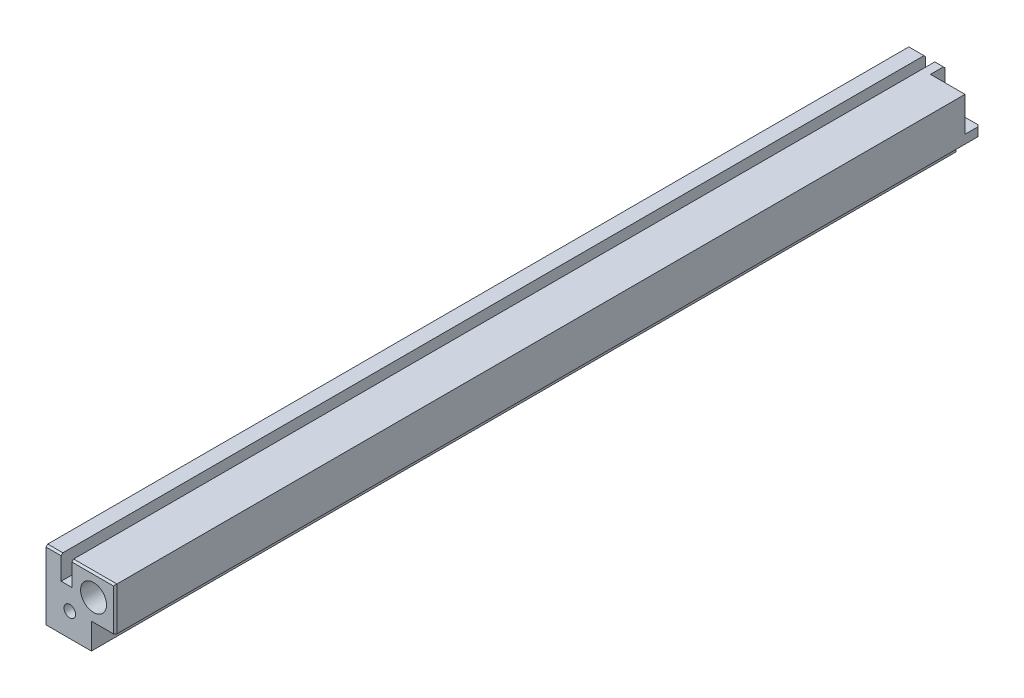
ISO-10303-21;
HEADER;
FILE_DESCRIPTION(('STEP AP214'),'2;1');
FILE_NAME('part.step','',(''),(''),'','','');
FILE_SCHEMA(('AUTOMOTIVE_DESIGN { 1 0 10303 214 1 1 1 1 }'));
ENDSEC;
DATA;
#1=APPLICATION_CONTEXT('core data for automotive mechanical design processes');
#2=APPLICATION_PROTOCOL_DEFINITION('international standard','automotive_design',2000,#1);
#3=PRODUCT_CONTEXT('',#1,'mechanical');
#4=PRODUCT('Part','Part','',(#3));
#5=PRODUCT_RELATED_PRODUCT_CATEGORY('part','',(#4));
#6=PRODUCT_DEFINITION_FORMATION('','',#4);
#7=PRODUCT_DEFINITION_CONTEXT('part definition',#1,'design');
#8=PRODUCT_DEFINITION('design','',#6,#7);
#9=PRODUCT_DEFINITION_SHAPE('','',#8);
#10=(LENGTH_UNIT() NAMED_UNIT(*) SI_UNIT(.MILLI.,.METRE.));
#11=(NAMED_UNIT(*) PLANE_ANGLE_UNIT() SI_UNIT($,.RADIAN.));
#12=(NAMED_UNIT(*) SI_UNIT($,.STERADIAN.) SOLID_ANGLE_UNIT());
#13=UNCERTAINTY_MEASURE_WITH_UNIT(LENGTH_MEASURE(1.E-05),#10,'distance_accuracy_value','');
#14=(GEOMETRIC_REPRESENTATION_CONTEXT(3) GLOBAL_UNCERTAINTY_ASSIGNED_CONTEXT((#13)) GLOBAL_UNIT_ASSIGNED_CONTEXT((#10,
#11,#12)) REPRESENTATION_CONTEXT('',''));
#15=CARTESIAN_POINT('',(0.,0.,0.));
#16=DIRECTION('',(0.,0.,1.));
#17=DIRECTION('',(1.,0.,0.));
#18=AXIS2_PLACEMENT_3D('',#15,#16,#17);
#19=CARTESIAN_POINT('',(-475.615205241627,-3.55874384236452,200.));
#20=DIRECTION('',(0.,-1.,0.));
#21=DIRECTION('',(0.,0.,-1.));
#22=AXIS2_PLACEMENT_3D('',#19,#20,#21);
#23=PLANE('',#22);
#24=DIRECTION('',(0.,0.,-1.));
#25=VECTOR('',#24,1.);
#26=CARTESIAN_POINT('',(-475.615205241627,-3.55874384236452,200.));
#27=LINE('',#26,#25);
#28=CARTESIAN_POINT('',(-475.615205241627,-3.55874384236452,199.6));
#29=VERTEX_POINT('',#28);
#30=CARTESIAN_POINT('',(-475.615205241627,-3.55874384236452,0.400000000000092));
#31=VERTEX_POINT('',#30);
#32=EDGE_CURVE('E221',#29,#31,#27,.T.);
#33=ORIENTED_EDGE('',*,*,#32,.F.);
#34=DIRECTION('',(1.,0.,0.));
#35=VECTOR('',#34,1.);
#36=CARTESIAN_POINT('',(-472.115205241627,-3.55874384236452,199.6));
#37=LINE('',#36,#35);
#38=CARTESIAN_POINT('',(-472.115205241627,-3.55874384236452,199.6));
#39=VERTEX_POINT('',#38);
#40=EDGE_CURVE('E258',#29,#39,#37,.T.);
#41=ORIENTED_EDGE('',*,*,#40,.T.);
#42=DIRECTION('',(0.,0.,1.));
#43=VECTOR('',#42,1.);
#44=CARTESIAN_POINT('',(-472.115205241627,-3.55874384236452,0.));
#45=LINE('',#44,#43);
#46=CARTESIAN_POINT('',(-472.115205241627,-3.55874384236452,0.400000000000092));
#47=VERTEX_POINT('',#46);
#48=EDGE_CURVE('E216',#47,#39,#45,.T.);
#49=ORIENTED_EDGE('',*,*,#48,.F.);
#50=DIRECTION('',(-1.,0.,0.));
#51=VECTOR('',#50,1.);
#52=CARTESIAN_POINT('',(-475.615205241627,-3.55874384236452,0.400000000000092));
#53=LINE('',#52,#51);
#54=EDGE_CURVE('E255',#47,#31,#53,.T.);
#55=ORIENTED_EDGE('',*,*,#54,.T.);
#56=EDGE_LOOP('',(#33,#41,#49,#55));
#57=FACE_BOUND('',#56,.T.);
#58=ADVANCED_FACE('F34',(#57),#23,.F.);
#59=CARTESIAN_POINT('',(-459.615205241627,-3.55874384236452,200.));
#60=DIRECTION('',(-1.,0.,0.));
#61=DIRECTION('',(0.,-1.,0.));
#62=AXIS2_PLACEMENT_3D('',#59,#60,#61);
#63=PLANE('',#62);
#64=DIRECTION('',(0.,0.,-1.));
#65=VECTOR('',#64,1.);
#66=CARTESIAN_POINT('',(-459.615205241627,-11.5587438423645,3.00000000000013));
#67=LINE('',#66,#65);
#68=CARTESIAN_POINT('',(-459.615205241627,-11.5587438423645,3.40000000000012));
#69=VERTEX_POINT('',#68);
#70=CARTESIAN_POINT('',(-459.615205241627,-11.5587438423645,0.400000000000099));
#71=VERTEX_POINT('',#70);
#72=EDGE_CURVE('E58',#69,#71,#67,.T.);
#73=ORIENTED_EDGE('',*,*,#72,.F.);
#74=DIRECTION('',(0.,1.,0.));
#75=VECTOR('',#74,1.);
#76=CARTESIAN_POINT('',(-459.615205241627,-3.55874384236452,3.40000000000012));
#77=LINE('',#76,#75);
#78=CARTESIAN_POINT('',(-459.615205241627,-3.55874384236452,3.40000000000012));
#79=VERTEX_POINT('',#78);
#80=EDGE_CURVE('E284',#69,#79,#77,.T.);
#81=ORIENTED_EDGE('',*,*,#80,.T.);
#82=DIRECTION('',(0.,0.,-1.));
#83=VECTOR('',#82,1.);
#84=CARTESIAN_POINT('',(-459.615205241627,-3.55874384236452,200.));
#85=LINE('',#84,#83);
#86=CARTESIAN_POINT('',(-459.615205241627,-3.55874384236452,199.6));
#87=VERTEX_POINT('',#86);
#88=EDGE_CURVE('E224',#87,#79,#85,.T.);
#89=ORIENTED_EDGE('',*,*,#88,.F.);
#90=DIRECTION('',(0.,-1.,0.));
#91=VECTOR('',#90,1.);
#92=CARTESIAN_POINT('',(-459.615205241627,-13.5587438423645,199.6));
#93=LINE('',#92,#91);
#94=CARTESIAN_POINT('',(-459.615205241627,-13.5587438423645,199.6));
#95=VERTEX_POINT('',#94);
#96=EDGE_CURVE('E237',#87,#95,#93,.T.);
#97=ORIENTED_EDGE('',*,*,#96,.T.);
#98=DIRECTION('',(0.,0.,1.));
#99=VECTOR('',#98,1.);
#100=CARTESIAN_POINT('',(-459.615205241627,-13.5587438423645,0.));
#101=LINE('',#100,#99);
#102=CARTESIAN_POINT('',(-459.615205241627,-13.5587438423645,0.400000000000092));
#103=VERTEX_POINT('',#102);
#104=EDGE_CURVE('E195',#103,#95,#101,.T.);
#105=ORIENTED_EDGE('',*,*,#104,.F.);
#106=DIRECTION('',(0.,1.,0.));
#107=VECTOR('',#106,1.);
#108=CARTESIAN_POINT('',(-459.615205241627,-3.55874384236452,0.400000000000092));
#109=LINE('',#108,#107);
#110=EDGE_CURVE('E235',#103,#71,#109,.T.);
#111=ORIENTED_EDGE('',*,*,#110,.T.);
#112=EDGE_LOOP('',(#73,#81,#89,#97,#105,#111));
#113=FACE_BOUND('',#112,.T.);
#114=ADVANCED_FACE('F302',(#113),#63,.F.);
#115=ORIENTED_EDGE('',*,*,#88,.T.);
#116=DIRECTION('',(-1.,0.,0.));
#117=VECTOR('',#116,1.);
#118=CARTESIAN_POINT('',(-467.615205241627,-3.55874384236452,3.40000000000012));
#119=LINE('',#118,#117);
#120=CARTESIAN_POINT('',(-467.615205241627,-3.55874384236452,3.40000000000012));
#121=VERTEX_POINT('',#120);
#122=EDGE_CURVE('E286',#79,#121,#119,.T.);
#123=ORIENTED_EDGE('',*,*,#122,.T.);
#124=DIRECTION('',(0.,0.,-1.));
#125=VECTOR('',#124,1.);
#126=CARTESIAN_POINT('',(-467.615205241627,-3.55874384236452,3.00000000000013));
#127=LINE('',#126,#125);
#128=CARTESIAN_POINT('',(-467.615205241627,-3.55874384236452,0.400000000000093));
#129=VERTEX_POINT('',#128);
#130=EDGE_CURVE('E50',#121,#129,#127,.T.);
#131=ORIENTED_EDGE('',*,*,#130,.T.);
#132=DIRECTION('',(-1.,0.,0.));
#133=VECTOR('',#132,1.);
#134=CARTESIAN_POINT('',(-475.615205241627,-3.55874384236452,0.400000000000092));
#135=LINE('',#134,#133);
#136=CARTESIAN_POINT('',(-469.615205241627,-3.55874384236452,0.400000000000092));
#137=VERTEX_POINT('',#136);
#138=EDGE_CURVE('E247',#129,#137,#135,.T.);
#139=ORIENTED_EDGE('',*,*,#138,.T.);
#140=DIRECTION('',(0.,0.,1.));
#141=VECTOR('',#140,1.);
#142=CARTESIAN_POINT('',(-469.615205241627,-3.55874384236452,0.));
#143=LINE('',#142,#141);
#144=CARTESIAN_POINT('',(-469.615205241627,-3.55874384236452,199.6));
#145=VERTEX_POINT('',#144);
#146=EDGE_CURVE('E368',#137,#145,#143,.T.);
#147=ORIENTED_EDGE('',*,*,#146,.T.);
#148=DIRECTION('',(1.,0.,0.));
#149=VECTOR('',#148,1.);
#150=CARTESIAN_POINT('',(-459.615205241627,-3.55874384236452,199.6));
#151=LINE('',#150,#149);
#152=EDGE_CURVE('E249',#145,#87,#151,.T.);
#153=ORIENTED_EDGE('',*,*,#152,.T.);
#154=EDGE_LOOP('',(#115,#123,#131,#139,#147,#153));
#155=FACE_BOUND('',#154,.T.);
#156=ADVANCED_FACE('F306',(#155),#23,.F.);
#157=CARTESIAN_POINT('',(-475.615205241627,-3.55874384236452,200.));
#158=DIRECTION('',(1.,0.,0.));
#159=DIRECTION('',(0.,1.,0.));
#160=AXIS2_PLACEMENT_3D('',#157,#158,#159);
#161=PLANE('',#160);
#162=DIRECTION('',(0.,-1.,0.));
#163=VECTOR('',#162,1.);
#164=CARTESIAN_POINT('',(-475.615205241627,-3.55874384236452,200.));
#165=LINE('',#164,#163);
#166=CARTESIAN_POINT('',(-475.615205241627,-3.95874384236453,200.));
#167=VERTEX_POINT('',#166);
#168=CARTESIAN_POINT('',(-475.615205241627,-19.5587438423645,200.));
#169=VERTEX_POINT('',#168);
#170=EDGE_CURVE('E211',#167,#169,#165,.T.);
#171=ORIENTED_EDGE('',*,*,#170,.F.);
#172=DIRECTION('',(0.,0.707106781186548,-0.707106781186548));
#173=VECTOR('',#172,1.);
#174=CARTESIAN_POINT('',(-475.615205241627,-3.95874384236453,200.));
#175=LINE('',#174,#173);
#176=EDGE_CURVE('E253',#167,#29,#175,.T.);
#177=ORIENTED_EDGE('',*,*,#176,.T.);
#178=ORIENTED_EDGE('',*,*,#32,.T.);
#179=DIRECTION('',(0.,0.707106781186548,0.707106781186548));
#180=VECTOR('',#179,1.);
#181=CARTESIAN_POINT('',(-475.615205241627,-3.55874384236452,0.400000000000092));
#182=LINE('',#181,#180);
#183=CARTESIAN_POINT('',(-475.615205241627,-3.95874384236453,0.));
#184=VERTEX_POINT('',#183);
#185=EDGE_CURVE('E251',#31,#184,#182,.F.);
#186=ORIENTED_EDGE('',*,*,#185,.T.);
#187=DIRECTION('',(0.,-1.,0.));
#188=VECTOR('',#187,1.);
#189=CARTESIAN_POINT('',(-475.615205241627,-3.55874384236452,0.));
#190=LINE('',#189,#188);
#191=CARTESIAN_POINT('',(-475.615205241627,-19.5587438423645,0.));
#192=VERTEX_POINT('',#191);
#193=EDGE_CURVE('E212',#184,#192,#190,.T.);
#194=ORIENTED_EDGE('',*,*,#193,.T.);
#195=DIRECTION('',(0.,0.,-1.));
#196=VECTOR('',#195,1.);
#197=CARTESIAN_POINT('',(-475.615205241627,-19.5587438423645,200.));
#198=LINE('',#197,#196);
#199=EDGE_CURVE('E210',#169,#192,#198,.T.);
#200=ORIENTED_EDGE('',*,*,#199,.F.);
#201=EDGE_LOOP('',(#171,#177,#178,#186,#194,#200));
#202=FACE_BOUND('',#201,.T.);
#203=ADVANCED_FACE('F387',(#202),#161,.F.);
#204=CARTESIAN_POINT('',(-475.615205241627,-19.5587438423645,200.));
#205=DIRECTION('',(0.,1.,0.));
#206=DIRECTION('',(0.,0.,1.));
#207=AXIS2_PLACEMENT_3D('',#204,#205,#206);
#208=PLANE('',#207);
#209=DIRECTION('',(1.,0.,0.));
#210=VECTOR('',#209,1.);
#211=CARTESIAN_POINT('',(-475.615205241627,-19.5587438423645,0.));
#212=LINE('',#211,#210);
#213=CARTESIAN_POINT('',(-465.115205241627,-19.5587438423645,0.));
#214=VERTEX_POINT('',#213);
#215=EDGE_CURVE('E189',#192,#214,#212,.T.);
#216=ORIENTED_EDGE('',*,*,#215,.T.);
#217=DIRECTION('',(0.,0.,-1.));
#218=VECTOR('',#217,1.);
#219=CARTESIAN_POINT('',(-465.115205241627,-19.5587438423645,0.));
#220=LINE('',#219,#218);
#221=CARTESIAN_POINT('',(-465.115205241627,-19.5587438423645,200.));
#222=VERTEX_POINT('',#221);
#223=EDGE_CURVE('E198',#222,#214,#220,.T.);
#224=ORIENTED_EDGE('',*,*,#223,.F.);
#225=DIRECTION('',(1.,0.,0.));
#226=VECTOR('',#225,1.);
#227=CARTESIAN_POINT('',(-475.615205241627,-19.5587438423645,200.));
#228=LINE('',#227,#226);
#229=EDGE_CURVE('E214',#169,#222,#228,.T.);
#230=ORIENTED_EDGE('',*,*,#229,.F.);
#231=ORIENTED_EDGE('',*,*,#199,.T.);
#232=EDGE_LOOP('',(#216,#224,#230,#231));
#233=FACE_BOUND('',#232,.T.);
#234=ADVANCED_FACE('F208',(#233),#208,.F.);
#235=CARTESIAN_POINT('',(-467.615205241627,-11.5587438423645,200.));
#236=DIRECTION('',(0.,0.,1.));
#237=DIRECTION('',(1.,0.,0.));
#238=AXIS2_PLACEMENT_3D('',#235,#236,#237);
#239=PLANE('',#238);
#240=ORIENTED_EDGE('',*,*,#229,.T.);
#241=DIRECTION('',(0.,-1.,0.));
#242=VECTOR('',#241,1.);
#243=CARTESIAN_POINT('',(-465.115205241627,-16.0587438423645,200.));
#244=LINE('',#243,#242);
#245=CARTESIAN_POINT('',(-465.115205241627,-13.5587438423645,200.));
#246=VERTEX_POINT('',#245);
#247=EDGE_CURVE('E201',#246,#222,#244,.T.);
#248=ORIENTED_EDGE('',*,*,#247,.F.);
#249=DIRECTION('',(-1.,0.,0.));
#250=VECTOR('',#249,1.);
#251=CARTESIAN_POINT('',(-459.615205241627,-13.5587438423645,200.));
#252=LINE('',#251,#250);
#253=CARTESIAN_POINT('',(-460.015205241627,-13.5587438423645,200.));
#254=VERTEX_POINT('',#253);
#255=EDGE_CURVE('E274',#254,#246,#252,.T.);
#256=ORIENTED_EDGE('',*,*,#255,.F.);
#257=DIRECTION('',(0.,1.,0.));
#258=VECTOR('',#257,1.);
#259=CARTESIAN_POINT('',(-460.015205241627,-3.55874384236452,200.));
#260=LINE('',#259,#258);
#261=CARTESIAN_POINT('',(-460.015205241627,-3.95874384236453,200.));
#262=VERTEX_POINT('',#261);
#263=EDGE_CURVE('E232',#254,#262,#260,.T.);
#264=ORIENTED_EDGE('',*,*,#263,.T.);
#265=DIRECTION('',(-1.,0.,0.));
#266=VECTOR('',#265,1.);
#267=CARTESIAN_POINT('',(-469.615205241627,-3.95874384236453,200.));
#268=LINE('',#267,#266);
#269=CARTESIAN_POINT('',(-469.615205241627,-3.95874384236453,200.));
#270=VERTEX_POINT('',#269);
#271=EDGE_CURVE('E230',#262,#270,#268,.T.);
#272=ORIENTED_EDGE('',*,*,#271,.T.);
#273=DIRECTION('',(0.,1.,0.));
#274=VECTOR('',#273,1.);
#275=CARTESIAN_POINT('',(-469.615205241627,-3.55874384236452,200.));
#276=LINE('',#275,#274);
#277=CARTESIAN_POINT('',(-469.615205241627,-9.05874384236452,200.));
#278=VERTEX_POINT('',#277);
#279=EDGE_CURVE('E351',#278,#270,#276,.T.);
#280=ORIENTED_EDGE('',*,*,#279,.F.);
#281=DIRECTION('',(1.,0.,0.));
#282=VECTOR('',#281,1.);
#283=CARTESIAN_POINT('',(-472.115205241627,-9.05874384236452,200.));
#284=LINE('',#283,#282);
#285=CARTESIAN_POINT('',(-472.115205241627,-9.05874384236452,200.));
#286=VERTEX_POINT('',#285);
#287=EDGE_CURVE('E360',#286,#278,#284,.T.);
#288=ORIENTED_EDGE('',*,*,#287,.F.);
#289=DIRECTION('',(0.,-1.,0.));
#290=VECTOR('',#289,1.);
#291=CARTESIAN_POINT('',(-472.115205241627,-3.55874384236452,200.));
#292=LINE('',#291,#290);
#293=CARTESIAN_POINT('',(-472.115205241627,-3.95874384236453,200.));
#294=VERTEX_POINT('',#293);
#295=EDGE_CURVE('E358',#294,#286,#292,.T.);
#296=ORIENTED_EDGE('',*,*,#295,.F.);
#297=DIRECTION('',(-1.,0.,0.));
#298=VECTOR('',#297,1.);
#299=CARTESIAN_POINT('',(-475.615205241627,-3.95874384236453,200.));
#300=LINE('',#299,#298);
#301=EDGE_CURVE('E227',#294,#167,#300,.T.);
#302=ORIENTED_EDGE('',*,*,#301,.T.);
#303=ORIENTED_EDGE('',*,*,#170,.T.);
#304=EDGE_LOOP('',(#240,#248,#256,#264,#272,#280,#288,#296,#302,#303));
#305=FACE_BOUND('',#304,.T.);
#306=CARTESIAN_POINT('',(-464.615205241627,-8.55874384236452,200.));
#307=DIRECTION('',(0.,0.,-1.));
#308=DIRECTION('',(-1.,0.,0.));
#309=AXIS2_PLACEMENT_3D('',#306,#307,#308);
#310=CIRCLE('',#309,2.99999999999999);
#311=CARTESIAN_POINT('',(-467.615205241627,-8.55874384236452,200.));
#312=VERTEX_POINT('',#311);
#313=EDGE_CURVE('E441',#312,#312,#310,.T.);
#314=ORIENTED_EDGE('',*,*,#313,.T.);
#315=EDGE_LOOP('',(#314));
#316=FACE_BOUND('',#315,.T.);
#317=CARTESIAN_POINT('',(-470.115205241627,-14.0587438423645,200.));
#318=DIRECTION('',(0.,0.,1.));
#319=DIRECTION('',(1.,0.,0.));
#320=AXIS2_PLACEMENT_3D('',#317,#318,#319);
#321=CIRCLE('',#320,1.34999999999999);
#322=CARTESIAN_POINT('',(-468.765205241627,-14.0587438423645,200.));
#323=VERTEX_POINT('',#322);
#324=EDGE_CURVE('E333',#323,#323,#321,.T.);
#325=ORIENTED_EDGE('',*,*,#324,.F.);
#326=EDGE_LOOP('',(#325));
#327=FACE_BOUND('',#326,.T.);
#328=ADVANCED_FACE('F380',(#305,#316,#327),#239,.T.);
#329=CARTESIAN_POINT('',(-467.615205241627,-11.5587438423645,0.));
#330=DIRECTION('',(0.,0.,1.));
#331=DIRECTION('',(1.,0.,0.));
#332=AXIS2_PLACEMENT_3D('',#329,#330,#331);
#333=PLANE('',#332);
#334=CARTESIAN_POINT('',(-470.115205241627,-14.0587438423645,0.));
#335=DIRECTION('',(0.,0.,-1.));
#336=DIRECTION('',(-1.,0.,0.));
#337=AXIS2_PLACEMENT_3D('',#334,#335,#336);
#338=CIRCLE('',#337,1.34999999999999);
#339=CARTESIAN_POINT('',(-471.465205241627,-14.0587438423645,0.));
#340=VERTEX_POINT('',#339);
#341=EDGE_CURVE('E343',#340,#340,#338,.T.);
#342=ORIENTED_EDGE('',*,*,#341,.F.);
#343=EDGE_LOOP('',(#342));
#344=FACE_BOUND('',#343,.T.);
#345=DIRECTION('',(0.,-1.,0.));
#346=VECTOR('',#345,1.);
#347=CARTESIAN_POINT('',(-465.115205241627,-16.0587438423645,0.));
#348=LINE('',#347,#346);
#349=CARTESIAN_POINT('',(-465.115205241627,-13.5587438423645,0.));
#350=VERTEX_POINT('',#349);
#351=EDGE_CURVE('E184',#350,#214,#348,.T.);
#352=ORIENTED_EDGE('',*,*,#351,.T.);
#353=ORIENTED_EDGE('',*,*,#215,.F.);
#354=ORIENTED_EDGE('',*,*,#193,.F.);
#355=DIRECTION('',(1.,0.,0.));
#356=VECTOR('',#355,1.);
#357=CARTESIAN_POINT('',(-467.615205241627,-3.95874384236453,0.));
#358=LINE('',#357,#356);
#359=CARTESIAN_POINT('',(-472.115205241627,-3.95874384236453,0.));
#360=VERTEX_POINT('',#359);
#361=EDGE_CURVE('E264',#184,#360,#358,.T.);
#362=ORIENTED_EDGE('',*,*,#361,.T.);
#363=DIRECTION('',(0.,-1.,0.));
#364=VECTOR('',#363,1.);
#365=CARTESIAN_POINT('',(-472.115205241627,-3.55874384236452,0.));
#366=LINE('',#365,#364);
#367=CARTESIAN_POINT('',(-472.115205241627,-9.05874384236452,0.));
#368=VERTEX_POINT('',#367);
#369=EDGE_CURVE('E348',#360,#368,#366,.T.);
#370=ORIENTED_EDGE('',*,*,#369,.T.);
#371=DIRECTION('',(1.,0.,0.));
#372=VECTOR('',#371,1.);
#373=CARTESIAN_POINT('',(-472.115205241627,-9.05874384236452,0.));
#374=LINE('',#373,#372);
#375=CARTESIAN_POINT('',(-469.615205241627,-9.05874384236452,0.));
#376=VERTEX_POINT('',#375);
#377=EDGE_CURVE('E350',#368,#376,#374,.T.);
#378=ORIENTED_EDGE('',*,*,#377,.T.);
#379=DIRECTION('',(0.,1.,0.));
#380=VECTOR('',#379,1.);
#381=CARTESIAN_POINT('',(-469.615205241627,-3.55874384236452,0.));
#382=LINE('',#381,#380);
#383=CARTESIAN_POINT('',(-469.615205241627,-3.95874384236453,0.));
#384=VERTEX_POINT('',#383);
#385=EDGE_CURVE('E354',#376,#384,#382,.T.);
#386=ORIENTED_EDGE('',*,*,#385,.T.);
#387=DIRECTION('',(1.,0.,0.));
#388=VECTOR('',#387,1.);
#389=CARTESIAN_POINT('',(-467.615205241627,-3.95874384236453,0.));
#390=LINE('',#389,#388);
#391=CARTESIAN_POINT('',(-467.615205241627,-3.95874384236453,0.));
#392=VERTEX_POINT('',#391);
#393=EDGE_CURVE('E268',#384,#392,#390,.T.);
#394=ORIENTED_EDGE('',*,*,#393,.T.);
#395=DIRECTION('',(0.,1.,0.));
#396=VECTOR('',#395,1.);
#397=CARTESIAN_POINT('',(-467.615205241627,-3.55874384236452,1.29046354242725E-13));
#398=LINE('',#397,#396);
#399=CARTESIAN_POINT('',(-467.615205241627,-8.55874384236452,1.29046354242725E-13));
#400=VERTEX_POINT('',#399);
#401=EDGE_CURVE('E322',#400,#392,#398,.T.);
#402=ORIENTED_EDGE('',*,*,#401,.F.);
#403=CARTESIAN_POINT('',(-464.615205241627,-8.55874384236452,1.29046354242725E-13));
#404=DIRECTION('',(0.,0.,-1.));
#405=DIRECTION('',(-1.,0.,0.));
#406=AXIS2_PLACEMENT_3D('',#403,#404,#405);
#407=CIRCLE('',#406,3.);
#408=CARTESIAN_POINT('',(-464.615205241627,-11.5587438423645,1.29046354242725E-13));
#409=VERTEX_POINT('',#408);
#410=EDGE_CURVE('E328',#409,#400,#407,.T.);
#411=ORIENTED_EDGE('',*,*,#410,.F.);
#412=DIRECTION('',(-1.,0.,0.));
#413=VECTOR('',#412,1.);
#414=CARTESIAN_POINT('',(-459.615205241627,-11.5587438423645,1.29046354242725E-13));
#415=LINE('',#414,#413);
#416=CARTESIAN_POINT('',(-460.015205241627,-11.5587438423645,1.29046354242725E-13));
#417=VERTEX_POINT('',#416);
#418=EDGE_CURVE('E326',#417,#409,#415,.T.);
#419=ORIENTED_EDGE('',*,*,#418,.F.);
#420=DIRECTION('',(0.,-1.,0.));
#421=VECTOR('',#420,1.);
#422=CARTESIAN_POINT('',(-460.015205241627,-11.5587438423645,0.));
#423=LINE('',#422,#421);
#424=CARTESIAN_POINT('',(-460.015205241627,-13.5587438423645,0.));
#425=VERTEX_POINT('',#424);
#426=EDGE_CURVE('E266',#417,#425,#423,.T.);
#427=ORIENTED_EDGE('',*,*,#426,.T.);
#428=DIRECTION('',(-1.,0.,0.));
#429=VECTOR('',#428,1.);
#430=CARTESIAN_POINT('',(-459.615205241627,-13.5587438423645,0.));
#431=LINE('',#430,#429);
#432=EDGE_CURVE('E191',#425,#350,#431,.T.);
#433=ORIENTED_EDGE('',*,*,#432,.T.);
#434=EDGE_LOOP('',(#352,#353,#354,#362,#370,#378,#386,#394,#402,#411,#419,#427,#433));
#435=FACE_BOUND('',#434,.T.);
#436=ADVANCED_FACE('F186',(#344,#435),#333,.F.);
#437=CARTESIAN_POINT('',(-465.115205241627,-16.0587438423645,0.));
#438=DIRECTION('',(-1.,0.,0.));
#439=DIRECTION('',(0.,0.,1.));
#440=AXIS2_PLACEMENT_3D('',#437,#438,#439);
#441=PLANE('',#440);
#442=ORIENTED_EDGE('',*,*,#247,.T.);
#443=ORIENTED_EDGE('',*,*,#223,.T.);
#444=ORIENTED_EDGE('',*,*,#351,.F.);
#445=DIRECTION('',(0.,0.,1.));
#446=VECTOR('',#445,1.);
#447=CARTESIAN_POINT('',(-465.115205241627,-13.5587438423645,0.));
#448=LINE('',#447,#446);
#449=EDGE_CURVE('E361',#350,#246,#448,.T.);
#450=ORIENTED_EDGE('',*,*,#449,.T.);
#451=EDGE_LOOP('',(#442,#443,#444,#450));
#452=FACE_BOUND('',#451,.T.);
#453=ADVANCED_FACE('F199',(#452),#441,.F.);
#454=CARTESIAN_POINT('',(-459.615205241627,-13.5587438423645,0.));
#455=DIRECTION('',(0.,1.,0.));
#456=DIRECTION('',(-1.,0.,0.));
#457=AXIS2_PLACEMENT_3D('',#454,#455,#456);
#458=PLANE('',#457);
#459=ORIENTED_EDGE('',*,*,#104,.T.);
#460=DIRECTION('',(-0.707106781186548,0.,0.707106781186548));
#461=VECTOR('',#460,1.);
#462=CARTESIAN_POINT('',(-460.015205241627,-13.5587438423645,200.));
#463=LINE('',#462,#461);
#464=EDGE_CURVE('E241',#95,#254,#463,.T.);
#465=ORIENTED_EDGE('',*,*,#464,.T.);
#466=ORIENTED_EDGE('',*,*,#255,.T.);
#467=ORIENTED_EDGE('',*,*,#449,.F.);
#468=ORIENTED_EDGE('',*,*,#432,.F.);
#469=DIRECTION('',(-0.707106781186548,0.,-0.707106781186548));
#470=VECTOR('',#469,1.);
#471=CARTESIAN_POINT('',(-459.615205241627,-13.5587438423645,0.400000000000092));
#472=LINE('',#471,#470);
#473=EDGE_CURVE('E239',#425,#103,#472,.F.);
#474=ORIENTED_EDGE('',*,*,#473,.T.);
#475=EDGE_LOOP('',(#459,#465,#466,#467,#468,#474));
#476=FACE_BOUND('',#475,.T.);
#477=ADVANCED_FACE('F431',(#476),#458,.F.);
#478=CARTESIAN_POINT('',(-472.115205241627,-3.55874384236452,0.));
#479=DIRECTION('',(-1.,0.,0.));
#480=DIRECTION('',(0.,-1.,0.));
#481=AXIS2_PLACEMENT_3D('',#478,#479,#480);
#482=PLANE('',#481);
#483=ORIENTED_EDGE('',*,*,#48,.T.);
#484=DIRECTION('',(0.,-0.707106781186548,0.707106781186548));
#485=VECTOR('',#484,1.);
#486=CARTESIAN_POINT('',(-472.115205241627,-3.95874384236453,200.));
#487=LINE('',#486,#485);
#488=EDGE_CURVE('E262',#39,#294,#487,.T.);
#489=ORIENTED_EDGE('',*,*,#488,.T.);
#490=ORIENTED_EDGE('',*,*,#295,.T.);
#491=DIRECTION('',(0.,0.,1.));
#492=VECTOR('',#491,1.);
#493=CARTESIAN_POINT('',(-472.115205241627,-9.05874384236452,0.));
#494=LINE('',#493,#492);
#495=EDGE_CURVE('E357',#368,#286,#494,.T.);
#496=ORIENTED_EDGE('',*,*,#495,.F.);
#497=ORIENTED_EDGE('',*,*,#369,.F.);
#498=DIRECTION('',(0.,-0.707106781186548,-0.707106781186548));
#499=VECTOR('',#498,1.);
#500=CARTESIAN_POINT('',(-472.115205241627,-3.55874384236452,0.400000000000092));
#501=LINE('',#500,#499);
#502=EDGE_CURVE('E260',#360,#47,#501,.F.);
#503=ORIENTED_EDGE('',*,*,#502,.T.);
#504=EDGE_LOOP('',(#483,#489,#490,#496,#497,#503));
#505=FACE_BOUND('',#504,.T.);
#506=ADVANCED_FACE('F396',(#505),#482,.F.);
#507=CARTESIAN_POINT('',(-469.615205241627,-3.55874384236452,0.));
#508=DIRECTION('',(1.,0.,0.));
#509=DIRECTION('',(0.,1.,0.));
#510=AXIS2_PLACEMENT_3D('',#507,#508,#509);
#511=PLANE('',#510);
#512=ORIENTED_EDGE('',*,*,#279,.T.);
#513=DIRECTION('',(0.,0.707106781186548,-0.707106781186548));
#514=VECTOR('',#513,1.);
#515=CARTESIAN_POINT('',(-469.615205241627,-3.95874384236453,200.));
#516=LINE('',#515,#514);
#517=EDGE_CURVE('E245',#270,#145,#516,.T.);
#518=ORIENTED_EDGE('',*,*,#517,.T.);
#519=ORIENTED_EDGE('',*,*,#146,.F.);
#520=DIRECTION('',(0.,0.707106781186548,0.707106781186548));
#521=VECTOR('',#520,1.);
#522=CARTESIAN_POINT('',(-469.615205241627,-3.55874384236452,0.400000000000093));
#523=LINE('',#522,#521);
#524=EDGE_CURVE('E243',#137,#384,#523,.F.);
#525=ORIENTED_EDGE('',*,*,#524,.T.);
#526=ORIENTED_EDGE('',*,*,#385,.F.);
#527=DIRECTION('',(0.,0.,1.));
#528=VECTOR('',#527,1.);
#529=CARTESIAN_POINT('',(-469.615205241627,-9.05874384236452,0.));
#530=LINE('',#529,#528);
#531=EDGE_CURVE('E370',#376,#278,#530,.T.);
#532=ORIENTED_EDGE('',*,*,#531,.T.);
#533=EDGE_LOOP('',(#512,#518,#519,#525,#526,#532));
#534=FACE_BOUND('',#533,.T.);
#535=ADVANCED_FACE('F482',(#534),#511,.F.);
#536=CARTESIAN_POINT('',(-472.115205241627,-9.05874384236452,0.));
#537=DIRECTION('',(0.,-1.,0.));
#538=DIRECTION('',(0.,0.,-1.));
#539=AXIS2_PLACEMENT_3D('',#536,#537,#538);
#540=PLANE('',#539);
#541=ORIENTED_EDGE('',*,*,#287,.T.);
#542=ORIENTED_EDGE('',*,*,#531,.F.);
#543=ORIENTED_EDGE('',*,*,#377,.F.);
#544=ORIENTED_EDGE('',*,*,#495,.T.);
#545=EDGE_LOOP('',(#541,#542,#543,#544));
#546=FACE_BOUND('',#545,.T.);
#547=ADVANCED_FACE('F408',(#546),#540,.F.);
#548=CARTESIAN_POINT('',(-467.615205241627,-3.95874384236453,200.));
#549=DIRECTION('',(0.,0.707106781186548,0.707106781186548));
#550=DIRECTION('',(1.,0.,0.));
#551=AXIS2_PLACEMENT_3D('',#548,#549,#550);
#552=PLANE('',#551);
#553=ORIENTED_EDGE('',*,*,#517,.F.);
#554=ORIENTED_EDGE('',*,*,#271,.F.);
#555=DIRECTION('',(0.577350269189626,0.577350269189626,-0.577350269189626));
#556=VECTOR('',#555,1.);
#557=CARTESIAN_POINT('',(-462.54853857496,-6.49207717569786,202.533333333333));
#558=LINE('',#557,#556);
#559=EDGE_CURVE('E272',#87,#262,#558,.F.);
#560=ORIENTED_EDGE('',*,*,#559,.F.);
#561=ORIENTED_EDGE('',*,*,#152,.F.);
#562=EDGE_LOOP('',(#553,#554,#560,#561));
#563=FACE_BOUND('',#562,.T.);
#564=ADVANCED_FACE('F422',(#563),#552,.T.);
#565=CARTESIAN_POINT('',(-460.015205241627,-11.5587438423645,200.));
#566=DIRECTION('',(0.707106781186548,0.,0.707106781186548));
#567=DIRECTION('',(0.,-1.,0.));
#568=AXIS2_PLACEMENT_3D('',#565,#566,#567);
#569=PLANE('',#568);
#570=ORIENTED_EDGE('',*,*,#464,.F.);
#571=ORIENTED_EDGE('',*,*,#96,.F.);
#572=ORIENTED_EDGE('',*,*,#559,.T.);
#573=ORIENTED_EDGE('',*,*,#263,.F.);
#574=EDGE_LOOP('',(#570,#571,#572,#573));
#575=FACE_BOUND('',#574,.T.);
#576=ADVANCED_FACE('F427',(#575),#569,.T.);
#577=CARTESIAN_POINT('',(-467.615205241627,-3.95874384236453,200.));
#578=DIRECTION('',(0.,0.707106781186548,0.707106781186548));
#579=DIRECTION('',(1.,0.,0.));
#580=AXIS2_PLACEMENT_3D('',#577,#578,#579);
#581=PLANE('',#580);
#582=ORIENTED_EDGE('',*,*,#488,.F.);
#583=ORIENTED_EDGE('',*,*,#40,.F.);
#584=ORIENTED_EDGE('',*,*,#176,.F.);
#585=ORIENTED_EDGE('',*,*,#301,.F.);
#586=EDGE_LOOP('',(#582,#583,#584,#585));
#587=FACE_BOUND('',#586,.T.);
#588=ADVANCED_FACE('F403',(#587),#581,.T.);
#589=CARTESIAN_POINT('',(-459.615205241627,-3.55874384236452,0.400000000000092));
#590=DIRECTION('',(-0.707106781186548,0.,0.707106781186548));
#591=DIRECTION('',(0.,1.,0.));
#592=AXIS2_PLACEMENT_3D('',#589,#590,#591);
#593=PLANE('',#592);
#594=DIRECTION('',(0.707106781186548,0.,0.707106781186548));
#595=VECTOR('',#594,1.);
#596=CARTESIAN_POINT('',(-459.615205241627,-11.5587438423645,0.400000000000091));
#597=LINE('',#596,#595);
#598=EDGE_CURVE('E277',#71,#417,#597,.F.);
#599=ORIENTED_EDGE('',*,*,#598,.F.);
#600=ORIENTED_EDGE('',*,*,#110,.F.);
#601=ORIENTED_EDGE('',*,*,#473,.F.);
#602=ORIENTED_EDGE('',*,*,#426,.F.);
#603=EDGE_LOOP('',(#599,#600,#601,#602));
#604=FACE_BOUND('',#603,.T.);
#605=ADVANCED_FACE('F435',(#604),#593,.F.);
#606=CARTESIAN_POINT('',(-475.615205241627,-3.55874384236452,0.400000000000092));
#607=DIRECTION('',(0.,-0.707106781186548,0.707106781186548));
#608=DIRECTION('',(-1.,0.,0.));
#609=AXIS2_PLACEMENT_3D('',#606,#607,#608);
#610=PLANE('',#609);
#611=DIRECTION('',(0.,-0.707106781186548,-0.707106781186548));
#612=VECTOR('',#611,1.);
#613=CARTESIAN_POINT('',(-467.615205241627,-3.55874384236452,0.400000000000092));
#614=LINE('',#613,#612);
#615=EDGE_CURVE('E271',#392,#129,#614,.F.);
#616=ORIENTED_EDGE('',*,*,#615,.F.);
#617=ORIENTED_EDGE('',*,*,#393,.F.);
#618=ORIENTED_EDGE('',*,*,#524,.F.);
#619=ORIENTED_EDGE('',*,*,#138,.F.);
#620=EDGE_LOOP('',(#616,#617,#618,#619));
#621=FACE_BOUND('',#620,.T.);
#622=ADVANCED_FACE('F416',(#621),#610,.F.);
#623=CARTESIAN_POINT('',(-475.615205241627,-3.55874384236452,0.400000000000092));
#624=DIRECTION('',(0.,-0.707106781186548,0.707106781186548));
#625=DIRECTION('',(-1.,0.,0.));
#626=AXIS2_PLACEMENT_3D('',#623,#624,#625);
#627=PLANE('',#626);
#628=ORIENTED_EDGE('',*,*,#502,.F.);
#629=ORIENTED_EDGE('',*,*,#361,.F.);
#630=ORIENTED_EDGE('',*,*,#185,.F.);
#631=ORIENTED_EDGE('',*,*,#54,.F.);
#632=EDGE_LOOP('',(#628,#629,#630,#631));
#633=FACE_BOUND('',#632,.T.);
#634=ADVANCED_FACE('F392',(#633),#627,.F.);
#635=CARTESIAN_POINT('',(-470.115205241627,-14.0587438423645,14.1888381643129));
#636=DIRECTION('',(0.,0.,-1.));
#637=DIRECTION('',(-1.,0.,0.));
#638=AXIS2_PLACEMENT_3D('',#635,#636,#637);
#639=CONICAL_SURFACE('',#638,1.35,1.02974425867665);
#640=CARTESIAN_POINT('',(-470.115205241627,-14.0587438423645,15.0000000000001));
#641=VERTEX_POINT('',#640);
#642=VERTEX_LOOP('',#641);
#643=FACE_BOUND('',#642,.T.);
#644=CARTESIAN_POINT('',(-470.115205241627,-14.0587438423645,14.1888381643129));
#645=DIRECTION('',(0.,0.,-1.));
#646=DIRECTION('',(-1.,0.,0.));
#647=AXIS2_PLACEMENT_3D('',#644,#645,#646);
#648=CIRCLE('',#647,1.35);
#649=CARTESIAN_POINT('',(-471.465205241627,-14.0587438423645,14.1888381643129));
#650=VERTEX_POINT('',#649);
#651=EDGE_CURVE('E275',#650,#650,#648,.T.);
#652=ORIENTED_EDGE('',*,*,#651,.T.);
#653=EDGE_LOOP('',(#652));
#654=FACE_BOUND('',#653,.T.);
#655=ADVANCED_FACE('F487',(#643,#654),#639,.F.);
#656=CARTESIAN_POINT('',(-470.115205241627,-14.0587438423645,0.));
#657=DIRECTION('',(0.,0.,-1.));
#658=DIRECTION('',(-1.,0.,0.));
#659=AXIS2_PLACEMENT_3D('',#656,#657,#658);
#660=CYLINDRICAL_SURFACE('',#659,1.34999999999999);
#661=ORIENTED_EDGE('',*,*,#651,.F.);
#662=EDGE_LOOP('',(#661));
#663=FACE_BOUND('',#662,.T.);
#664=ORIENTED_EDGE('',*,*,#341,.T.);
#665=EDGE_LOOP('',(#664));
#666=FACE_BOUND('',#665,.T.);
#667=ADVANCED_FACE('F490',(#663,#666),#660,.F.);
#668=CARTESIAN_POINT('',(-470.115205241627,-14.0587438423645,185.811161835687));
#669=DIRECTION('',(0.,0.,1.));
#670=DIRECTION('',(1.,0.,0.));
#671=AXIS2_PLACEMENT_3D('',#668,#669,#670);
#672=CONICAL_SURFACE('',#671,1.35,1.02974425867665);
#673=CARTESIAN_POINT('',(-470.115205241627,-14.0587438423645,185.));
#674=VERTEX_POINT('',#673);
#675=VERTEX_LOOP('',#674);
#676=FACE_BOUND('',#675,.T.);
#677=CARTESIAN_POINT('',(-470.115205241627,-14.0587438423645,185.811161835687));
#678=DIRECTION('',(0.,0.,1.));
#679=DIRECTION('',(1.,0.,0.));
#680=AXIS2_PLACEMENT_3D('',#677,#678,#679);
#681=CIRCLE('',#680,1.35);
#682=CARTESIAN_POINT('',(-468.765205241627,-14.0587438423645,185.811161835687));
#683=VERTEX_POINT('',#682);
#684=EDGE_CURVE('E340',#683,#683,#681,.T.);
#685=ORIENTED_EDGE('',*,*,#684,.T.);
#686=EDGE_LOOP('',(#685));
#687=FACE_BOUND('',#686,.T.);
#688=ADVANCED_FACE('F494',(#676,#687),#672,.F.);
#689=CARTESIAN_POINT('',(-470.115205241627,-14.0587438423645,200.));
#690=DIRECTION('',(0.,0.,1.));
#691=DIRECTION('',(1.,0.,0.));
#692=AXIS2_PLACEMENT_3D('',#689,#690,#691);
#693=CYLINDRICAL_SURFACE('',#692,1.34999999999999);
#694=ORIENTED_EDGE('',*,*,#684,.F.);
#695=EDGE_LOOP('',(#694));
#696=FACE_BOUND('',#695,.T.);
#697=ORIENTED_EDGE('',*,*,#324,.T.);
#698=EDGE_LOOP('',(#697));
#699=FACE_BOUND('',#698,.T.);
#700=ADVANCED_FACE('F453',(#696,#699),#693,.F.);
#701=CARTESIAN_POINT('',(-467.615205241627,-3.55874384236452,3.00000000000013));
#702=DIRECTION('',(-1.,0.,0.));
#703=DIRECTION('',(0.,0.,1.));
#704=AXIS2_PLACEMENT_3D('',#701,#702,#703);
#705=PLANE('',#704);
#706=ORIENTED_EDGE('',*,*,#615,.T.);
#707=ORIENTED_EDGE('',*,*,#130,.F.);
#708=DIRECTION('',(0.,-0.70710678118657,-0.707106781186525));
#709=VECTOR('',#708,1.);
#710=CARTESIAN_POINT('',(-467.615205241627,-3.75874384236451,3.20000000000014));
#711=LINE('',#710,#709);
#712=CARTESIAN_POINT('',(-467.615205241627,-3.95874384236453,3.00000000000013));
#713=VERTEX_POINT('',#712);
#714=EDGE_CURVE('E11',#121,#713,#711,.T.);
#715=ORIENTED_EDGE('',*,*,#714,.T.);
#716=DIRECTION('',(0.,1.,0.));
#717=VECTOR('',#716,1.);
#718=CARTESIAN_POINT('',(-467.615205241627,-3.55874384236452,3.00000000000013));
#719=LINE('',#718,#717);
#720=CARTESIAN_POINT('',(-467.615205241627,-8.55874384236452,3.00000000000013));
#721=VERTEX_POINT('',#720);
#722=EDGE_CURVE('E315',#721,#713,#719,.T.);
#723=ORIENTED_EDGE('',*,*,#722,.F.);
#724=DIRECTION('',(0.,0.,-1.));
#725=VECTOR('',#724,1.);
#726=CARTESIAN_POINT('',(-467.615205241627,-8.55874384236452,3.00000000000013));
#727=LINE('',#726,#725);
#728=EDGE_CURVE('E334',#721,#400,#727,.T.);
#729=ORIENTED_EDGE('',*,*,#728,.T.);
#730=ORIENTED_EDGE('',*,*,#401,.T.);
#731=EDGE_LOOP('',(#706,#707,#715,#723,#729,#730));
#732=FACE_BOUND('',#731,.T.);
#733=ADVANCED_FACE('F314',(#732),#705,.F.);
#734=CARTESIAN_POINT('',(-464.615205241627,-8.55874384236452,3.00000000000013));
#735=DIRECTION('',(0.,0.,-1.));
#736=DIRECTION('',(-1.,0.,0.));
#737=AXIS2_PLACEMENT_3D('',#734,#735,#736);
#738=CYLINDRICAL_SURFACE('',#737,3.);
#739=ORIENTED_EDGE('',*,*,#410,.T.);
#740=ORIENTED_EDGE('',*,*,#728,.F.);
#741=CARTESIAN_POINT('',(-464.615205241627,-8.55874384236452,3.00000000000013));
#742=DIRECTION('',(0.,0.,-1.));
#743=DIRECTION('',(-1.,0.,0.));
#744=AXIS2_PLACEMENT_3D('',#741,#742,#743);
#745=CIRCLE('',#744,2.99999999999999);
#746=CARTESIAN_POINT('',(-464.615205241627,-11.5587438423645,3.00000000000013));
#747=VERTEX_POINT('',#746);
#748=EDGE_CURVE('E205',#721,#747,#745,.T.);
#749=ORIENTED_EDGE('',*,*,#748,.T.);
#750=DIRECTION('',(0.,0.,-1.));
#751=VECTOR('',#750,1.);
#752=CARTESIAN_POINT('',(-464.615205241627,-11.5587438423645,3.00000000000013));
#753=LINE('',#752,#751);
#754=EDGE_CURVE('E320',#747,#409,#753,.T.);
#755=ORIENTED_EDGE('',*,*,#754,.T.);
#756=EDGE_LOOP('',(#739,#740,#749,#755));
#757=FACE_BOUND('',#756,.T.);
#758=ORIENTED_EDGE('',*,*,#313,.F.);
#759=EDGE_LOOP('',(#758));
#760=FACE_BOUND('',#759,.T.);
#761=ADVANCED_FACE('F439',(#757,#760),#738,.F.);
#762=CARTESIAN_POINT('',(-459.615205241627,-11.5587438423645,3.00000000000013));
#763=DIRECTION('',(0.,-1.,0.));
#764=DIRECTION('',(0.,0.,-1.));
#765=AXIS2_PLACEMENT_3D('',#762,#763,#764);
#766=PLANE('',#765);
#767=ORIENTED_EDGE('',*,*,#598,.T.);
#768=ORIENTED_EDGE('',*,*,#418,.T.);
#769=ORIENTED_EDGE('',*,*,#754,.F.);
#770=DIRECTION('',(-1.,0.,0.));
#771=VECTOR('',#770,1.);
#772=CARTESIAN_POINT('',(-459.615205241627,-11.5587438423645,3.00000000000013));
#773=LINE('',#772,#771);
#774=CARTESIAN_POINT('',(-460.015205241627,-11.5587438423645,3.00000000000013));
#775=VERTEX_POINT('',#774);
#776=EDGE_CURVE('E295',#775,#747,#773,.T.);
#777=ORIENTED_EDGE('',*,*,#776,.F.);
#778=DIRECTION('',(0.707106781186571,0.,0.707106781186524));
#779=VECTOR('',#778,1.);
#780=CARTESIAN_POINT('',(-459.815205241627,-11.5587438423645,3.20000000000014));
#781=LINE('',#780,#779);
#782=EDGE_CURVE('E44',#775,#69,#781,.T.);
#783=ORIENTED_EDGE('',*,*,#782,.T.);
#784=ORIENTED_EDGE('',*,*,#72,.T.);
#785=EDGE_LOOP('',(#767,#768,#769,#777,#783,#784));
#786=FACE_BOUND('',#785,.T.);
#787=ADVANCED_FACE('F291',(#786),#766,.F.);
#788=CARTESIAN_POINT('',(-464.615205241627,-8.55874384236452,3.00000000000013));
#789=DIRECTION('',(0.,0.,-1.));
#790=DIRECTION('',(-1.,0.,0.));
#791=AXIS2_PLACEMENT_3D('',#788,#789,#790);
#792=PLANE('',#791);
#793=ORIENTED_EDGE('',*,*,#748,.F.);
#794=ORIENTED_EDGE('',*,*,#722,.T.);
#795=DIRECTION('',(1.,0.,0.));
#796=VECTOR('',#795,1.);
#797=CARTESIAN_POINT('',(-459.615205241627,-3.95874384236453,3.00000000000013));
#798=LINE('',#797,#796);
#799=CARTESIAN_POINT('',(-460.015205241627,-3.95874384236453,3.00000000000013));
#800=VERTEX_POINT('',#799);
#801=EDGE_CURVE('E279',#713,#800,#798,.T.);
#802=ORIENTED_EDGE('',*,*,#801,.T.);
#803=DIRECTION('',(0.,-1.,0.));
#804=VECTOR('',#803,1.);
#805=CARTESIAN_POINT('',(-460.015205241627,-11.5587438423645,3.00000000000013));
#806=LINE('',#805,#804);
#807=EDGE_CURVE('E281',#800,#775,#806,.T.);
#808=ORIENTED_EDGE('',*,*,#807,.T.);
#809=ORIENTED_EDGE('',*,*,#776,.T.);
#810=EDGE_LOOP('',(#793,#794,#802,#808,#809));
#811=FACE_BOUND('',#810,.T.);
#812=ADVANCED_FACE('F317',(#811),#792,.T.);
#813=CARTESIAN_POINT('',(-464.615205241627,-3.95874384236453,3.00000000000013));
#814=DIRECTION('',(0.,0.707106781186525,-0.70710678118657));
#815=DIRECTION('',(-1.,0.,0.));
#816=AXIS2_PLACEMENT_3D('',#813,#814,#815);
#817=PLANE('',#816);
#818=ORIENTED_EDGE('',*,*,#714,.F.);
#819=ORIENTED_EDGE('',*,*,#122,.F.);
#820=DIRECTION('',(-0.577350269189639,-0.577350269189637,-0.577350269189601));
#821=VECTOR('',#820,1.);
#822=CARTESIAN_POINT('',(-461.54853857496,-5.49207717569792,1.46666666666683));
#823=LINE('',#822,#821);
#824=EDGE_CURVE('E39',#800,#79,#823,.F.);
#825=ORIENTED_EDGE('',*,*,#824,.F.);
#826=ORIENTED_EDGE('',*,*,#801,.F.);
#827=EDGE_LOOP('',(#818,#819,#825,#826));
#828=FACE_BOUND('',#827,.T.);
#829=ADVANCED_FACE('F37',(#828),#817,.T.);
#830=CARTESIAN_POINT('',(-460.015205241627,-8.55874384236452,3.00000000000013));
#831=DIRECTION('',(0.707106781186524,0.,-0.707106781186571));
#832=DIRECTION('',(0.,1.,0.));
#833=AXIS2_PLACEMENT_3D('',#830,#831,#832);
#834=PLANE('',#833);
#835=ORIENTED_EDGE('',*,*,#824,.T.);
#836=ORIENTED_EDGE('',*,*,#80,.F.);
#837=ORIENTED_EDGE('',*,*,#782,.F.);
#838=ORIENTED_EDGE('',*,*,#807,.F.);
#839=EDGE_LOOP('',(#835,#836,#837,#838));
#840=FACE_BOUND('',#839,.T.);
#841=ADVANCED_FACE('F299',(#840),#834,.T.);
#842=CLOSED_SHELL('',(#58,#114,#156,#203,#234,#328,#436,#453,#477,#506,#535,#547,#564,#576,#588,
#605,#622,#634,#655,#667,#688,#700,#733,#761,#787,#812,#829,#841));
#843=MANIFOLD_SOLID_BREP('B2',#842);
#844=ADVANCED_BREP_SHAPE_REPRESENTATION('',(#18,#843),#14);
#845=SHAPE_DEFINITION_REPRESENTATION(#9,#844);
ENDSEC;
END-ISO-10303-21;
